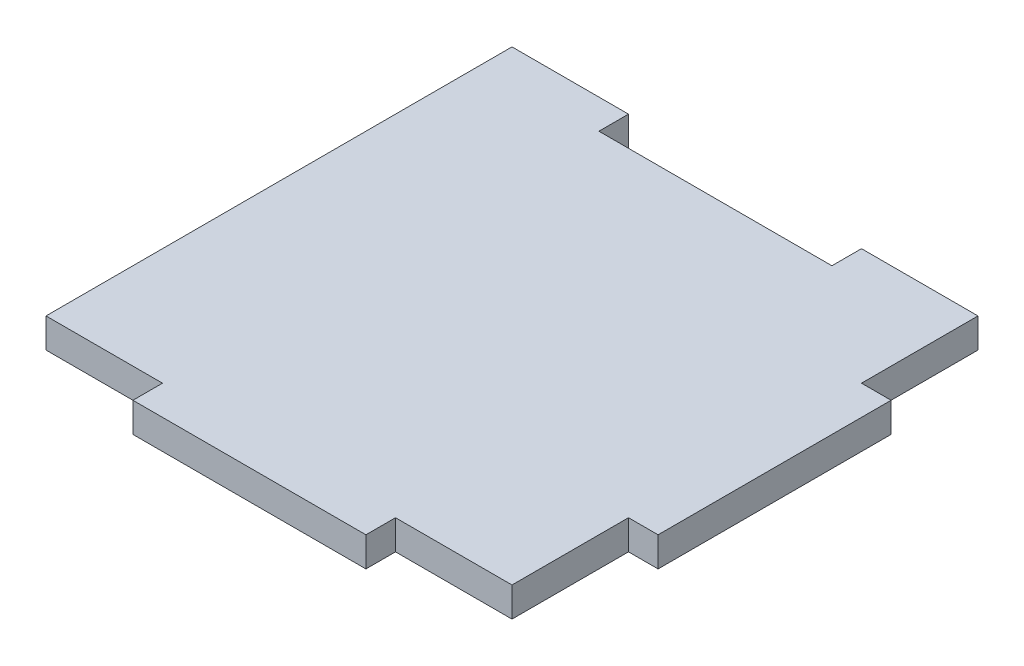
ISO-10303-21;
HEADER;
FILE_DESCRIPTION(('STEP AP214'),'2;1');
FILE_NAME('part.step','',(''),(''),'','','');
FILE_SCHEMA(('AUTOMOTIVE_DESIGN { 1 0 10303 214 1 1 1 1 }'));
ENDSEC;
DATA;
#1=APPLICATION_CONTEXT('core data for automotive mechanical design processes');
#2=APPLICATION_PROTOCOL_DEFINITION('international standard','automotive_design',2000,#1);
#3=PRODUCT_CONTEXT('',#1,'mechanical');
#4=PRODUCT('Part','Part','',(#3));
#5=PRODUCT_RELATED_PRODUCT_CATEGORY('part','',(#4));
#6=PRODUCT_DEFINITION_FORMATION('','',#4);
#7=PRODUCT_DEFINITION_CONTEXT('part definition',#1,'design');
#8=PRODUCT_DEFINITION('design','',#6,#7);
#9=PRODUCT_DEFINITION_SHAPE('','',#8);
#10=(LENGTH_UNIT() NAMED_UNIT(*) SI_UNIT(.MILLI.,.METRE.));
#11=(NAMED_UNIT(*) PLANE_ANGLE_UNIT() SI_UNIT($,.RADIAN.));
#12=(NAMED_UNIT(*) SI_UNIT($,.STERADIAN.) SOLID_ANGLE_UNIT());
#13=UNCERTAINTY_MEASURE_WITH_UNIT(LENGTH_MEASURE(1.E-05),#10,'distance_accuracy_value','');
#14=(GEOMETRIC_REPRESENTATION_CONTEXT(3) GLOBAL_UNCERTAINTY_ASSIGNED_CONTEXT((#13)) GLOBAL_UNIT_ASSIGNED_CONTEXT((#10,
#11,#12)) REPRESENTATION_CONTEXT('',''));
#15=CARTESIAN_POINT('',(0.,0.,0.));
#16=DIRECTION('',(0.,0.,1.));
#17=DIRECTION('',(1.,0.,0.));
#18=AXIS2_PLACEMENT_3D('',#15,#16,#17);
#19=CARTESIAN_POINT('',(-25.,3.175,-25.));
#20=DIRECTION('',(0.,0.,1.));
#21=DIRECTION('',(1.,0.,0.));
#22=AXIS2_PLACEMENT_3D('',#19,#20,#21);
#23=PLANE('',#22);
#24=DIRECTION('',(-1.,0.,0.));
#25=VECTOR('',#24,1.);
#26=CARTESIAN_POINT('',(-25.,3.175,-25.));
#27=LINE('',#26,#25);
#28=CARTESIAN_POINT('',(-12.5,3.175,-25.));
#29=VERTEX_POINT('',#28);
#30=CARTESIAN_POINT('',(-25.,3.175,-25.));
#31=VERTEX_POINT('',#30);
#32=EDGE_CURVE('E236',#29,#31,#27,.T.);
#33=ORIENTED_EDGE('',*,*,#32,.F.);
#34=DIRECTION('',(0.,1.,0.));
#35=VECTOR('',#34,1.);
#36=CARTESIAN_POINT('',(-12.5,0.,-25.));
#37=LINE('',#36,#35);
#38=CARTESIAN_POINT('',(-12.5,0.,-25.));
#39=VERTEX_POINT('',#38);
#40=EDGE_CURVE('E179',#39,#29,#37,.T.);
#41=ORIENTED_EDGE('',*,*,#40,.F.);
#42=DIRECTION('',(-1.,0.,0.));
#43=VECTOR('',#42,1.);
#44=CARTESIAN_POINT('',(-25.,0.,-25.));
#45=LINE('',#44,#43);
#46=CARTESIAN_POINT('',(-25.,0.,-25.));
#47=VERTEX_POINT('',#46);
#48=EDGE_CURVE('E170',#39,#47,#45,.T.);
#49=ORIENTED_EDGE('',*,*,#48,.T.);
#50=DIRECTION('',(0.,-1.,0.));
#51=VECTOR('',#50,1.);
#52=CARTESIAN_POINT('',(-25.,3.175,-25.));
#53=LINE('',#52,#51);
#54=EDGE_CURVE('E44',#31,#47,#53,.T.);
#55=ORIENTED_EDGE('',*,*,#54,.F.);
#56=EDGE_LOOP('',(#33,#41,#49,#55));
#57=FACE_BOUND('',#56,.T.);
#58=ADVANCED_FACE('F36',(#57),#23,.F.);
#59=CARTESIAN_POINT('',(25.,3.175,25.));
#60=DIRECTION('',(-1.,0.,0.));
#61=DIRECTION('',(0.,0.,1.));
#62=AXIS2_PLACEMENT_3D('',#59,#60,#61);
#63=PLANE('',#62);
#64=DIRECTION('',(0.,1.,0.));
#65=VECTOR('',#64,1.);
#66=CARTESIAN_POINT('',(25.,-25.2008060386965,-12.5));
#67=LINE('',#66,#65);
#68=CARTESIAN_POINT('',(25.,0.,-12.5));
#69=VERTEX_POINT('',#68);
#70=CARTESIAN_POINT('',(25.,3.175,-12.5));
#71=VERTEX_POINT('',#70);
#72=EDGE_CURVE('E186',#69,#71,#67,.T.);
#73=ORIENTED_EDGE('',*,*,#72,.F.);
#74=DIRECTION('',(0.,0.,-1.));
#75=VECTOR('',#74,1.);
#76=CARTESIAN_POINT('',(25.,0.,25.));
#77=LINE('',#76,#75);
#78=CARTESIAN_POINT('',(25.,0.,-25.));
#79=VERTEX_POINT('',#78);
#80=EDGE_CURVE('E221',#69,#79,#77,.T.);
#81=ORIENTED_EDGE('',*,*,#80,.T.);
#82=DIRECTION('',(0.,-1.,0.));
#83=VECTOR('',#82,1.);
#84=CARTESIAN_POINT('',(25.,3.175,-25.));
#85=LINE('',#84,#83);
#86=CARTESIAN_POINT('',(25.,3.175,-25.));
#87=VERTEX_POINT('',#86);
#88=EDGE_CURVE('E11',#87,#79,#85,.T.);
#89=ORIENTED_EDGE('',*,*,#88,.F.);
#90=DIRECTION('',(0.,0.,-1.));
#91=VECTOR('',#90,1.);
#92=CARTESIAN_POINT('',(25.,3.175,25.));
#93=LINE('',#92,#91);
#94=EDGE_CURVE('E237',#71,#87,#93,.T.);
#95=ORIENTED_EDGE('',*,*,#94,.F.);
#96=EDGE_LOOP('',(#73,#81,#89,#95));
#97=FACE_BOUND('',#96,.T.);
#98=ADVANCED_FACE('F281',(#97),#63,.F.);
#99=CARTESIAN_POINT('',(-25.,3.175,25.));
#100=DIRECTION('',(0.,0.,-1.));
#101=DIRECTION('',(-1.,0.,0.));
#102=AXIS2_PLACEMENT_3D('',#99,#100,#101);
#103=PLANE('',#102);
#104=DIRECTION('',(0.,1.,0.));
#105=VECTOR('',#104,1.);
#106=CARTESIAN_POINT('',(12.5,-25.2008060386965,25.));
#107=LINE('',#106,#105);
#108=CARTESIAN_POINT('',(12.5,0.,25.));
#109=VERTEX_POINT('',#108);
#110=CARTESIAN_POINT('',(12.5,3.175,25.));
#111=VERTEX_POINT('',#110);
#112=EDGE_CURVE('E216',#109,#111,#107,.T.);
#113=ORIENTED_EDGE('',*,*,#112,.F.);
#114=DIRECTION('',(1.,0.,0.));
#115=VECTOR('',#114,1.);
#116=CARTESIAN_POINT('',(-25.,0.,25.));
#117=LINE('',#116,#115);
#118=CARTESIAN_POINT('',(25.,0.,25.));
#119=VERTEX_POINT('',#118);
#120=EDGE_CURVE('E256',#109,#119,#117,.T.);
#121=ORIENTED_EDGE('',*,*,#120,.T.);
#122=DIRECTION('',(0.,-1.,0.));
#123=VECTOR('',#122,1.);
#124=CARTESIAN_POINT('',(25.,3.175,25.));
#125=LINE('',#124,#123);
#126=CARTESIAN_POINT('',(25.,3.175,25.));
#127=VERTEX_POINT('',#126);
#128=EDGE_CURVE('E247',#127,#119,#125,.T.);
#129=ORIENTED_EDGE('',*,*,#128,.F.);
#130=DIRECTION('',(1.,0.,0.));
#131=VECTOR('',#130,1.);
#132=CARTESIAN_POINT('',(-25.,3.175,25.));
#133=LINE('',#132,#131);
#134=EDGE_CURVE('E243',#111,#127,#133,.T.);
#135=ORIENTED_EDGE('',*,*,#134,.F.);
#136=EDGE_LOOP('',(#113,#121,#129,#135));
#137=FACE_BOUND('',#136,.T.);
#138=ADVANCED_FACE('F286',(#137),#103,.F.);
#139=CARTESIAN_POINT('',(25.,0.,12.5));
#140=VERTEX_POINT('',#139);
#141=EDGE_CURVE('E248',#119,#140,#77,.T.);
#142=ORIENTED_EDGE('',*,*,#141,.T.);
#143=DIRECTION('',(0.,1.,0.));
#144=VECTOR('',#143,1.);
#145=CARTESIAN_POINT('',(25.,-25.2008060386965,12.5));
#146=LINE('',#145,#144);
#147=CARTESIAN_POINT('',(25.,3.175,12.5));
#148=VERTEX_POINT('',#147);
#149=EDGE_CURVE('E189',#140,#148,#146,.T.);
#150=ORIENTED_EDGE('',*,*,#149,.T.);
#151=EDGE_CURVE('E233',#127,#148,#93,.T.);
#152=ORIENTED_EDGE('',*,*,#151,.F.);
#153=ORIENTED_EDGE('',*,*,#128,.T.);
#154=EDGE_LOOP('',(#142,#150,#152,#153));
#155=FACE_BOUND('',#154,.T.);
#156=ADVANCED_FACE('F38',(#155),#63,.F.);
#157=CARTESIAN_POINT('',(12.5,0.,-25.));
#158=VERTEX_POINT('',#157);
#159=EDGE_CURVE('E251',#79,#158,#45,.T.);
#160=ORIENTED_EDGE('',*,*,#159,.T.);
#161=DIRECTION('',(0.,1.,0.));
#162=VECTOR('',#161,1.);
#163=CARTESIAN_POINT('',(12.5,0.,-25.));
#164=LINE('',#163,#162);
#165=CARTESIAN_POINT('',(12.5,3.175,-25.));
#166=VERTEX_POINT('',#165);
#167=EDGE_CURVE('E182',#158,#166,#164,.T.);
#168=ORIENTED_EDGE('',*,*,#167,.T.);
#169=EDGE_CURVE('E238',#87,#166,#27,.T.);
#170=ORIENTED_EDGE('',*,*,#169,.F.);
#171=ORIENTED_EDGE('',*,*,#88,.T.);
#172=EDGE_LOOP('',(#160,#168,#170,#171));
#173=FACE_BOUND('',#172,.T.);
#174=ADVANCED_FACE('F282',(#173),#23,.F.);
#175=CARTESIAN_POINT('',(-25.,3.175,25.));
#176=DIRECTION('',(1.,0.,0.));
#177=DIRECTION('',(0.,0.,-1.));
#178=AXIS2_PLACEMENT_3D('',#175,#176,#177);
#179=PLANE('',#178);
#180=DIRECTION('',(0.,0.,1.));
#181=VECTOR('',#180,1.);
#182=CARTESIAN_POINT('',(-25.,0.,25.));
#183=LINE('',#182,#181);
#184=CARTESIAN_POINT('',(-25.,0.,25.));
#185=VERTEX_POINT('',#184);
#186=EDGE_CURVE('E254',#47,#185,#183,.T.);
#187=ORIENTED_EDGE('',*,*,#186,.T.);
#188=DIRECTION('',(0.,-1.,0.));
#189=VECTOR('',#188,1.);
#190=CARTESIAN_POINT('',(-25.,3.175,25.));
#191=LINE('',#190,#189);
#192=CARTESIAN_POINT('',(-25.,3.175,25.));
#193=VERTEX_POINT('',#192);
#194=EDGE_CURVE('E262',#193,#185,#191,.T.);
#195=ORIENTED_EDGE('',*,*,#194,.F.);
#196=DIRECTION('',(0.,0.,1.));
#197=VECTOR('',#196,1.);
#198=CARTESIAN_POINT('',(-25.,3.175,25.));
#199=LINE('',#198,#197);
#200=EDGE_CURVE('E241',#31,#193,#199,.T.);
#201=ORIENTED_EDGE('',*,*,#200,.F.);
#202=ORIENTED_EDGE('',*,*,#54,.T.);
#203=EDGE_LOOP('',(#187,#195,#201,#202));
#204=FACE_BOUND('',#203,.T.);
#205=ADVANCED_FACE('F268',(#204),#179,.F.);
#206=CARTESIAN_POINT('',(-12.5,0.,25.));
#207=VERTEX_POINT('',#206);
#208=EDGE_CURVE('E257',#185,#207,#117,.T.);
#209=ORIENTED_EDGE('',*,*,#208,.T.);
#210=DIRECTION('',(0.,1.,0.));
#211=VECTOR('',#210,1.);
#212=CARTESIAN_POINT('',(-12.5,-25.2008060386965,25.));
#213=LINE('',#212,#211);
#214=CARTESIAN_POINT('',(-12.5,3.175,25.));
#215=VERTEX_POINT('',#214);
#216=EDGE_CURVE('E211',#207,#215,#213,.T.);
#217=ORIENTED_EDGE('',*,*,#216,.T.);
#218=EDGE_CURVE('E244',#193,#215,#133,.T.);
#219=ORIENTED_EDGE('',*,*,#218,.F.);
#220=ORIENTED_EDGE('',*,*,#194,.T.);
#221=EDGE_LOOP('',(#209,#217,#219,#220));
#222=FACE_BOUND('',#221,.T.);
#223=ADVANCED_FACE('F275',(#222),#103,.F.);
#224=CARTESIAN_POINT('',(0.,3.175,0.));
#225=DIRECTION('',(0.,-1.,0.));
#226=DIRECTION('',(0.,0.,-1.));
#227=AXIS2_PLACEMENT_3D('',#224,#225,#226);
#228=PLANE('',#227);
#229=DIRECTION('',(1.,0.,0.));
#230=VECTOR('',#229,1.);
#231=CARTESIAN_POINT('',(-12.5,3.175,-21.825));
#232=LINE('',#231,#230);
#233=CARTESIAN_POINT('',(-12.5,3.175,-21.825));
#234=VERTEX_POINT('',#233);
#235=CARTESIAN_POINT('',(12.5,3.175,-21.825));
#236=VERTEX_POINT('',#235);
#237=EDGE_CURVE('E173',#234,#236,#232,.T.);
#238=ORIENTED_EDGE('',*,*,#237,.F.);
#239=DIRECTION('',(0.,0.,1.));
#240=VECTOR('',#239,1.);
#241=CARTESIAN_POINT('',(-12.5,3.175,-25.));
#242=LINE('',#241,#240);
#243=EDGE_CURVE('E156',#29,#234,#242,.T.);
#244=ORIENTED_EDGE('',*,*,#243,.F.);
#245=ORIENTED_EDGE('',*,*,#32,.T.);
#246=ORIENTED_EDGE('',*,*,#200,.T.);
#247=ORIENTED_EDGE('',*,*,#218,.T.);
#248=DIRECTION('',(0.,0.,1.));
#249=VECTOR('',#248,1.);
#250=CARTESIAN_POINT('',(-12.5,3.175,25.));
#251=LINE('',#250,#249);
#252=CARTESIAN_POINT('',(-12.5,3.175,28.175));
#253=VERTEX_POINT('',#252);
#254=EDGE_CURVE('E208',#215,#253,#251,.T.);
#255=ORIENTED_EDGE('',*,*,#254,.T.);
#256=DIRECTION('',(-1.,0.,0.));
#257=VECTOR('',#256,1.);
#258=CARTESIAN_POINT('',(12.5,3.175,28.175));
#259=LINE('',#258,#257);
#260=CARTESIAN_POINT('',(12.5,3.175,28.175));
#261=VERTEX_POINT('',#260);
#262=EDGE_CURVE('E213',#261,#253,#259,.T.);
#263=ORIENTED_EDGE('',*,*,#262,.F.);
#264=DIRECTION('',(0.,0.,1.));
#265=VECTOR('',#264,1.);
#266=CARTESIAN_POINT('',(12.5,3.175,25.));
#267=LINE('',#266,#265);
#268=EDGE_CURVE('E218',#111,#261,#267,.T.);
#269=ORIENTED_EDGE('',*,*,#268,.F.);
#270=ORIENTED_EDGE('',*,*,#134,.T.);
#271=ORIENTED_EDGE('',*,*,#151,.T.);
#272=DIRECTION('',(1.,0.,0.));
#273=VECTOR('',#272,1.);
#274=CARTESIAN_POINT('',(25.,3.175,12.5));
#275=LINE('',#274,#273);
#276=CARTESIAN_POINT('',(28.175,3.175,12.5));
#277=VERTEX_POINT('',#276);
#278=EDGE_CURVE('E59',#148,#277,#275,.T.);
#279=ORIENTED_EDGE('',*,*,#278,.T.);
#280=DIRECTION('',(0.,0.,1.));
#281=VECTOR('',#280,1.);
#282=CARTESIAN_POINT('',(28.175,3.175,-12.5));
#283=LINE('',#282,#281);
#284=CARTESIAN_POINT('',(28.175,3.175,-12.5));
#285=VERTEX_POINT('',#284);
#286=EDGE_CURVE('E188',#285,#277,#283,.T.);
#287=ORIENTED_EDGE('',*,*,#286,.F.);
#288=DIRECTION('',(1.,0.,0.));
#289=VECTOR('',#288,1.);
#290=CARTESIAN_POINT('',(25.,3.175,-12.5));
#291=LINE('',#290,#289);
#292=EDGE_CURVE('E181',#71,#285,#291,.T.);
#293=ORIENTED_EDGE('',*,*,#292,.F.);
#294=ORIENTED_EDGE('',*,*,#94,.T.);
#295=ORIENTED_EDGE('',*,*,#169,.T.);
#296=DIRECTION('',(0.,0.,-1.));
#297=VECTOR('',#296,1.);
#298=CARTESIAN_POINT('',(12.5,3.175,-25.));
#299=LINE('',#298,#297);
#300=EDGE_CURVE('E171',#236,#166,#299,.T.);
#301=ORIENTED_EDGE('',*,*,#300,.F.);
#302=EDGE_LOOP('',(#238,#244,#245,#246,#247,#255,#263,#269,#270,#271,#279,#287,#293,#294,#295,#301));
#303=FACE_BOUND('',#302,.T.);
#304=ADVANCED_FACE('F278',(#303),#228,.F.);
#305=CARTESIAN_POINT('',(0.,0.,0.));
#306=DIRECTION('',(0.,-1.,0.));
#307=DIRECTION('',(0.,0.,-1.));
#308=AXIS2_PLACEMENT_3D('',#305,#306,#307);
#309=PLANE('',#308);
#310=DIRECTION('',(0.,0.,1.));
#311=VECTOR('',#310,1.);
#312=CARTESIAN_POINT('',(-12.5,0.,-25.));
#313=LINE('',#312,#311);
#314=CARTESIAN_POINT('',(-12.5,0.,-21.825));
#315=VERTEX_POINT('',#314);
#316=EDGE_CURVE('E153',#39,#315,#313,.T.);
#317=ORIENTED_EDGE('',*,*,#316,.T.);
#318=DIRECTION('',(1.,0.,0.));
#319=VECTOR('',#318,1.);
#320=CARTESIAN_POINT('',(-12.5,0.,-21.825));
#321=LINE('',#320,#319);
#322=CARTESIAN_POINT('',(12.5,0.,-21.825));
#323=VERTEX_POINT('',#322);
#324=EDGE_CURVE('E163',#315,#323,#321,.T.);
#325=ORIENTED_EDGE('',*,*,#324,.T.);
#326=DIRECTION('',(0.,0.,-1.));
#327=VECTOR('',#326,1.);
#328=CARTESIAN_POINT('',(12.5,0.,-25.));
#329=LINE('',#328,#327);
#330=EDGE_CURVE('E51',#323,#158,#329,.T.);
#331=ORIENTED_EDGE('',*,*,#330,.T.);
#332=ORIENTED_EDGE('',*,*,#159,.F.);
#333=ORIENTED_EDGE('',*,*,#80,.F.);
#334=DIRECTION('',(1.,0.,0.));
#335=VECTOR('',#334,1.);
#336=CARTESIAN_POINT('',(25.,0.,-12.5));
#337=LINE('',#336,#335);
#338=CARTESIAN_POINT('',(28.175,0.,-12.5));
#339=VERTEX_POINT('',#338);
#340=EDGE_CURVE('E200',#69,#339,#337,.T.);
#341=ORIENTED_EDGE('',*,*,#340,.T.);
#342=DIRECTION('',(0.,0.,1.));
#343=VECTOR('',#342,1.);
#344=CARTESIAN_POINT('',(28.175,0.,-12.5));
#345=LINE('',#344,#343);
#346=CARTESIAN_POINT('',(28.175,0.,12.5));
#347=VERTEX_POINT('',#346);
#348=EDGE_CURVE('E198',#339,#347,#345,.T.);
#349=ORIENTED_EDGE('',*,*,#348,.T.);
#350=DIRECTION('',(1.,0.,0.));
#351=VECTOR('',#350,1.);
#352=CARTESIAN_POINT('',(25.,0.,12.5));
#353=LINE('',#352,#351);
#354=EDGE_CURVE('E191',#140,#347,#353,.T.);
#355=ORIENTED_EDGE('',*,*,#354,.F.);
#356=ORIENTED_EDGE('',*,*,#141,.F.);
#357=ORIENTED_EDGE('',*,*,#120,.F.);
#358=DIRECTION('',(0.,0.,1.));
#359=VECTOR('',#358,1.);
#360=CARTESIAN_POINT('',(12.5,0.,25.));
#361=LINE('',#360,#359);
#362=CARTESIAN_POINT('',(12.5,0.,28.175));
#363=VERTEX_POINT('',#362);
#364=EDGE_CURVE('E202',#109,#363,#361,.T.);
#365=ORIENTED_EDGE('',*,*,#364,.T.);
#366=DIRECTION('',(-1.,0.,0.));
#367=VECTOR('',#366,1.);
#368=CARTESIAN_POINT('',(12.5,0.,28.175));
#369=LINE('',#368,#367);
#370=CARTESIAN_POINT('',(-12.5,0.,28.175));
#371=VERTEX_POINT('',#370);
#372=EDGE_CURVE('E212',#363,#371,#369,.T.);
#373=ORIENTED_EDGE('',*,*,#372,.T.);
#374=DIRECTION('',(0.,0.,1.));
#375=VECTOR('',#374,1.);
#376=CARTESIAN_POINT('',(-12.5,0.,25.));
#377=LINE('',#376,#375);
#378=EDGE_CURVE('E224',#207,#371,#377,.T.);
#379=ORIENTED_EDGE('',*,*,#378,.F.);
#380=ORIENTED_EDGE('',*,*,#208,.F.);
#381=ORIENTED_EDGE('',*,*,#186,.F.);
#382=ORIENTED_EDGE('',*,*,#48,.F.);
#383=EDGE_LOOP('',(#317,#325,#331,#332,#333,#341,#349,#355,#356,#357,#365,#373,#379,#380,#381,#382));
#384=FACE_BOUND('',#383,.T.);
#385=ADVANCED_FACE('F168',(#384),#309,.T.);
#386=CARTESIAN_POINT('',(-12.5,-25.2008060386965,25.));
#387=DIRECTION('',(-1.,0.,0.));
#388=DIRECTION('',(0.,0.,1.));
#389=AXIS2_PLACEMENT_3D('',#386,#387,#388);
#390=PLANE('',#389);
#391=ORIENTED_EDGE('',*,*,#216,.F.);
#392=ORIENTED_EDGE('',*,*,#378,.T.);
#393=DIRECTION('',(0.,1.,0.));
#394=VECTOR('',#393,1.);
#395=CARTESIAN_POINT('',(-12.5,-25.2008060386965,28.175));
#396=LINE('',#395,#394);
#397=EDGE_CURVE('E227',#371,#253,#396,.T.);
#398=ORIENTED_EDGE('',*,*,#397,.T.);
#399=ORIENTED_EDGE('',*,*,#254,.F.);
#400=EDGE_LOOP('',(#391,#392,#398,#399));
#401=FACE_BOUND('',#400,.T.);
#402=ADVANCED_FACE('F328',(#401),#390,.T.);
#403=CARTESIAN_POINT('',(12.5,-25.2008060386965,28.175));
#404=DIRECTION('',(0.,0.,-1.));
#405=DIRECTION('',(-1.,0.,0.));
#406=AXIS2_PLACEMENT_3D('',#403,#404,#405);
#407=PLANE('',#406);
#408=ORIENTED_EDGE('',*,*,#372,.F.);
#409=DIRECTION('',(0.,1.,0.));
#410=VECTOR('',#409,1.);
#411=CARTESIAN_POINT('',(12.5,-25.2008060386965,28.175));
#412=LINE('',#411,#410);
#413=EDGE_CURVE('E217',#363,#261,#412,.T.);
#414=ORIENTED_EDGE('',*,*,#413,.T.);
#415=ORIENTED_EDGE('',*,*,#262,.T.);
#416=ORIENTED_EDGE('',*,*,#397,.F.);
#417=EDGE_LOOP('',(#408,#414,#415,#416));
#418=FACE_BOUND('',#417,.T.);
#419=ADVANCED_FACE('F326',(#418),#407,.F.);
#420=CARTESIAN_POINT('',(12.5,-25.2008060386965,25.));
#421=DIRECTION('',(-1.,0.,0.));
#422=DIRECTION('',(0.,0.,1.));
#423=AXIS2_PLACEMENT_3D('',#420,#421,#422);
#424=PLANE('',#423);
#425=ORIENTED_EDGE('',*,*,#364,.F.);
#426=ORIENTED_EDGE('',*,*,#112,.T.);
#427=ORIENTED_EDGE('',*,*,#268,.T.);
#428=ORIENTED_EDGE('',*,*,#413,.F.);
#429=EDGE_LOOP('',(#425,#426,#427,#428));
#430=FACE_BOUND('',#429,.T.);
#431=ADVANCED_FACE('F323',(#430),#424,.F.);
#432=CARTESIAN_POINT('',(25.,-25.2008060386965,12.5));
#433=DIRECTION('',(0.,0.,1.));
#434=DIRECTION('',(1.,0.,0.));
#435=AXIS2_PLACEMENT_3D('',#432,#433,#434);
#436=PLANE('',#435);
#437=ORIENTED_EDGE('',*,*,#149,.F.);
#438=ORIENTED_EDGE('',*,*,#354,.T.);
#439=DIRECTION('',(0.,1.,0.));
#440=VECTOR('',#439,1.);
#441=CARTESIAN_POINT('',(28.175,-25.2008060386965,12.5));
#442=LINE('',#441,#440);
#443=EDGE_CURVE('E192',#347,#277,#442,.T.);
#444=ORIENTED_EDGE('',*,*,#443,.T.);
#445=ORIENTED_EDGE('',*,*,#278,.F.);
#446=EDGE_LOOP('',(#437,#438,#444,#445));
#447=FACE_BOUND('',#446,.T.);
#448=ADVANCED_FACE('F313',(#447),#436,.T.);
#449=CARTESIAN_POINT('',(28.175,-25.2008060386965,-12.5));
#450=DIRECTION('',(-1.,0.,0.));
#451=DIRECTION('',(0.,0.,1.));
#452=AXIS2_PLACEMENT_3D('',#449,#450,#451);
#453=PLANE('',#452);
#454=ORIENTED_EDGE('',*,*,#348,.F.);
#455=DIRECTION('',(0.,1.,0.));
#456=VECTOR('',#455,1.);
#457=CARTESIAN_POINT('',(28.175,-25.2008060386965,-12.5));
#458=LINE('',#457,#456);
#459=EDGE_CURVE('E194',#339,#285,#458,.T.);
#460=ORIENTED_EDGE('',*,*,#459,.T.);
#461=ORIENTED_EDGE('',*,*,#286,.T.);
#462=ORIENTED_EDGE('',*,*,#443,.F.);
#463=EDGE_LOOP('',(#454,#460,#461,#462));
#464=FACE_BOUND('',#463,.T.);
#465=ADVANCED_FACE('F310',(#464),#453,.F.);
#466=CARTESIAN_POINT('',(25.,-25.2008060386965,-12.5));
#467=DIRECTION('',(0.,0.,1.));
#468=DIRECTION('',(1.,0.,0.));
#469=AXIS2_PLACEMENT_3D('',#466,#467,#468);
#470=PLANE('',#469);
#471=ORIENTED_EDGE('',*,*,#340,.F.);
#472=ORIENTED_EDGE('',*,*,#72,.T.);
#473=ORIENTED_EDGE('',*,*,#292,.T.);
#474=ORIENTED_EDGE('',*,*,#459,.F.);
#475=EDGE_LOOP('',(#471,#472,#473,#474));
#476=FACE_BOUND('',#475,.T.);
#477=ADVANCED_FACE('F305',(#476),#470,.F.);
#478=CARTESIAN_POINT('',(-12.5,0.,-25.));
#479=DIRECTION('',(-1.,0.,0.));
#480=DIRECTION('',(0.,0.,1.));
#481=AXIS2_PLACEMENT_3D('',#478,#479,#480);
#482=PLANE('',#481);
#483=ORIENTED_EDGE('',*,*,#243,.T.);
#484=DIRECTION('',(0.,1.,0.));
#485=VECTOR('',#484,1.);
#486=CARTESIAN_POINT('',(-12.5,0.,-21.825));
#487=LINE('',#486,#485);
#488=EDGE_CURVE('E149',#315,#234,#487,.T.);
#489=ORIENTED_EDGE('',*,*,#488,.F.);
#490=ORIENTED_EDGE('',*,*,#316,.F.);
#491=ORIENTED_EDGE('',*,*,#40,.T.);
#492=EDGE_LOOP('',(#483,#489,#490,#491));
#493=FACE_BOUND('',#492,.T.);
#494=ADVANCED_FACE('F151',(#493),#482,.F.);
#495=CARTESIAN_POINT('',(12.5,0.,-25.));
#496=DIRECTION('',(1.,0.,0.));
#497=DIRECTION('',(0.,0.,-1.));
#498=AXIS2_PLACEMENT_3D('',#495,#496,#497);
#499=PLANE('',#498);
#500=ORIENTED_EDGE('',*,*,#300,.T.);
#501=ORIENTED_EDGE('',*,*,#167,.F.);
#502=ORIENTED_EDGE('',*,*,#330,.F.);
#503=DIRECTION('',(0.,1.,0.));
#504=VECTOR('',#503,1.);
#505=CARTESIAN_POINT('',(12.5,0.,-21.825));
#506=LINE('',#505,#504);
#507=EDGE_CURVE('E160',#323,#236,#506,.T.);
#508=ORIENTED_EDGE('',*,*,#507,.T.);
#509=EDGE_LOOP('',(#500,#501,#502,#508));
#510=FACE_BOUND('',#509,.T.);
#511=ADVANCED_FACE('F431',(#510),#499,.F.);
#512=CARTESIAN_POINT('',(-12.5,0.,-21.825));
#513=DIRECTION('',(0.,0.,1.));
#514=DIRECTION('',(1.,0.,0.));
#515=AXIS2_PLACEMENT_3D('',#512,#513,#514);
#516=PLANE('',#515);
#517=ORIENTED_EDGE('',*,*,#237,.T.);
#518=ORIENTED_EDGE('',*,*,#507,.F.);
#519=ORIENTED_EDGE('',*,*,#324,.F.);
#520=ORIENTED_EDGE('',*,*,#488,.T.);
#521=EDGE_LOOP('',(#517,#518,#519,#520));
#522=FACE_BOUND('',#521,.T.);
#523=ADVANCED_FACE('F164',(#522),#516,.F.);
#524=CLOSED_SHELL('',(#58,#98,#138,#156,#174,#205,#223,#304,#385,#402,#419,#431,#448,#465,#477,
#494,#511,#523));
#525=MANIFOLD_SOLID_BREP('B2',#524);
#526=ADVANCED_BREP_SHAPE_REPRESENTATION('',(#18,#525),#14);
#527=SHAPE_DEFINITION_REPRESENTATION(#9,#526);
ENDSEC;
END-ISO-10303-21;
